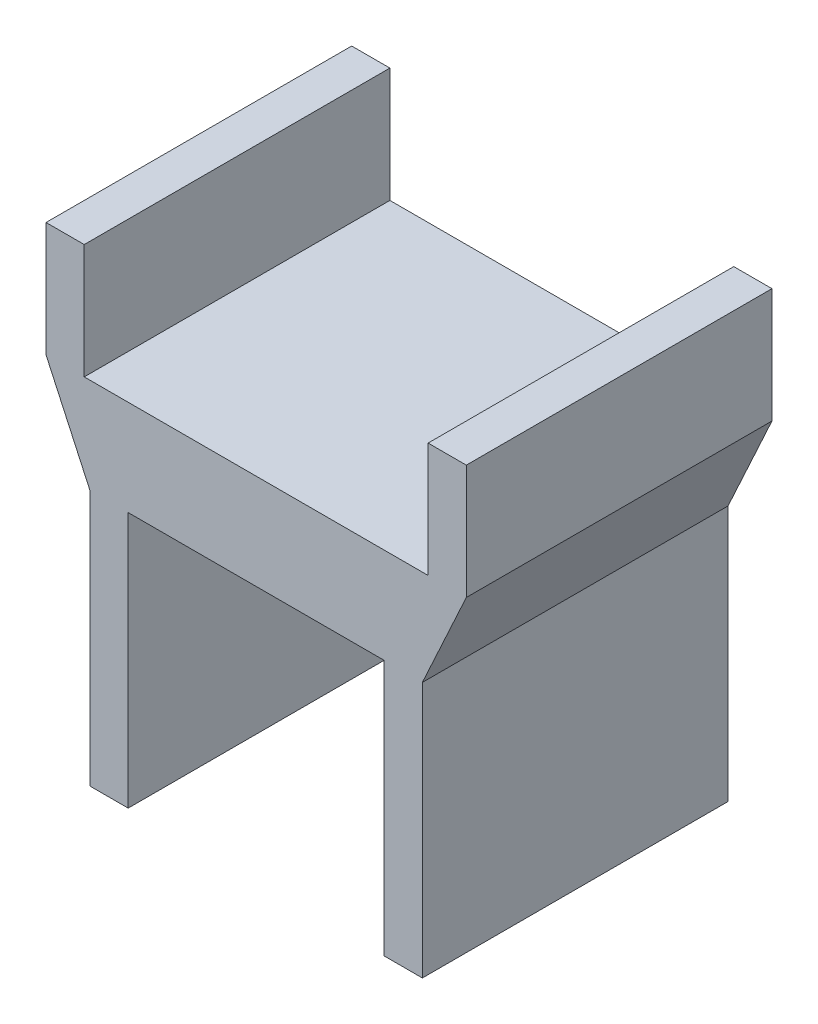
ISO-10303-21;
HEADER;
FILE_DESCRIPTION(('STEP AP214'),'2;1');
FILE_NAME('part.step','',(''),(''),'','','');
FILE_SCHEMA(('AUTOMOTIVE_DESIGN { 1 0 10303 214 1 1 1 1 }'));
ENDSEC;
DATA;
#1=APPLICATION_CONTEXT('core data for automotive mechanical design processes');
#2=APPLICATION_PROTOCOL_DEFINITION('international standard','automotive_design',2000,#1);
#3=PRODUCT_CONTEXT('',#1,'mechanical');
#4=PRODUCT('Part','Part','',(#3));
#5=PRODUCT_RELATED_PRODUCT_CATEGORY('part','',(#4));
#6=PRODUCT_DEFINITION_FORMATION('','',#4);
#7=PRODUCT_DEFINITION_CONTEXT('part definition',#1,'design');
#8=PRODUCT_DEFINITION('design','',#6,#7);
#9=PRODUCT_DEFINITION_SHAPE('','',#8);
#10=(LENGTH_UNIT() NAMED_UNIT(*) SI_UNIT(.MILLI.,.METRE.));
#11=(NAMED_UNIT(*) PLANE_ANGLE_UNIT() SI_UNIT($,.RADIAN.));
#12=(NAMED_UNIT(*) SI_UNIT($,.STERADIAN.) SOLID_ANGLE_UNIT());
#13=UNCERTAINTY_MEASURE_WITH_UNIT(LENGTH_MEASURE(1.E-05),#10,'distance_accuracy_value','');
#14=(GEOMETRIC_REPRESENTATION_CONTEXT(3) GLOBAL_UNCERTAINTY_ASSIGNED_CONTEXT((#13)) GLOBAL_UNIT_ASSIGNED_CONTEXT((#10,
#11,#12)) REPRESENTATION_CONTEXT('',''));
#15=CARTESIAN_POINT('',(0.,0.,0.));
#16=DIRECTION('',(0.,0.,1.));
#17=DIRECTION('',(1.,0.,0.));
#18=AXIS2_PLACEMENT_3D('',#15,#16,#17);
#19=CARTESIAN_POINT('',(0.,0.,16.));
#20=DIRECTION('',(1.,0.,0.));
#21=DIRECTION('',(0.,1.,0.));
#22=AXIS2_PLACEMENT_3D('',#19,#20,#21);
#23=PLANE('',#22);
#24=DIRECTION('',(0.,-1.,0.));
#25=VECTOR('',#24,1.);
#26=CARTESIAN_POINT('',(0.,0.,0.));
#27=LINE('',#26,#25);
#28=CARTESIAN_POINT('',(0.,0.,0.));
#29=VERTEX_POINT('',#28);
#30=CARTESIAN_POINT('',(0.,-13.4,0.));
#31=VERTEX_POINT('',#30);
#32=EDGE_CURVE('E174',#29,#31,#27,.T.);
#33=ORIENTED_EDGE('',*,*,#32,.F.);
#34=DIRECTION('',(0.,0.,-1.));
#35=VECTOR('',#34,1.);
#36=CARTESIAN_POINT('',(0.,0.,16.));
#37=LINE('',#36,#35);
#38=CARTESIAN_POINT('',(0.,0.,16.));
#39=VERTEX_POINT('',#38);
#40=EDGE_CURVE('E11',#39,#29,#37,.T.);
#41=ORIENTED_EDGE('',*,*,#40,.F.);
#42=DIRECTION('',(0.,-1.,0.));
#43=VECTOR('',#42,1.);
#44=CARTESIAN_POINT('',(0.,0.,16.));
#45=LINE('',#44,#43);
#46=CARTESIAN_POINT('',(0.,-13.4,16.));
#47=VERTEX_POINT('',#46);
#48=EDGE_CURVE('E214',#39,#47,#45,.T.);
#49=ORIENTED_EDGE('',*,*,#48,.T.);
#50=DIRECTION('',(0.,0.,-1.));
#51=VECTOR('',#50,1.);
#52=CARTESIAN_POINT('',(0.,-13.4,16.));
#53=LINE('',#52,#51);
#54=EDGE_CURVE('E49',#47,#31,#53,.T.);
#55=ORIENTED_EDGE('',*,*,#54,.T.);
#56=EDGE_LOOP('',(#33,#41,#49,#55));
#57=FACE_BOUND('',#56,.T.);
#58=ADVANCED_FACE('F33',(#57),#23,.T.);
#59=CARTESIAN_POINT('',(0.,0.,16.));
#60=DIRECTION('',(0.,1.,0.));
#61=DIRECTION('',(0.,0.,1.));
#62=AXIS2_PLACEMENT_3D('',#59,#60,#61);
#63=PLANE('',#62);
#64=DIRECTION('',(1.,0.,0.));
#65=VECTOR('',#64,1.);
#66=CARTESIAN_POINT('',(0.,0.,0.));
#67=LINE('',#66,#65);
#68=CARTESIAN_POINT('',(13.4,0.,0.));
#69=VERTEX_POINT('',#68);
#70=EDGE_CURVE('E176',#29,#69,#67,.T.);
#71=ORIENTED_EDGE('',*,*,#70,.T.);
#72=DIRECTION('',(0.,0.,-1.));
#73=VECTOR('',#72,1.);
#74=CARTESIAN_POINT('',(13.4,0.,16.));
#75=LINE('',#74,#73);
#76=CARTESIAN_POINT('',(13.4,0.,16.));
#77=VERTEX_POINT('',#76);
#78=EDGE_CURVE('E41',#77,#69,#75,.T.);
#79=ORIENTED_EDGE('',*,*,#78,.F.);
#80=DIRECTION('',(1.,0.,0.));
#81=VECTOR('',#80,1.);
#82=CARTESIAN_POINT('',(0.,0.,16.));
#83=LINE('',#82,#81);
#84=EDGE_CURVE('E565',#39,#77,#83,.T.);
#85=ORIENTED_EDGE('',*,*,#84,.F.);
#86=ORIENTED_EDGE('',*,*,#40,.T.);
#87=EDGE_LOOP('',(#71,#79,#85,#86));
#88=FACE_BOUND('',#87,.T.);
#89=ADVANCED_FACE('F302',(#88),#63,.F.);
#90=CARTESIAN_POINT('',(13.4,0.,16.));
#91=DIRECTION('',(1.,0.,0.));
#92=DIRECTION('',(0.,1.,0.));
#93=AXIS2_PLACEMENT_3D('',#90,#91,#92);
#94=PLANE('',#93);
#95=DIRECTION('',(0.,-1.,0.));
#96=VECTOR('',#95,1.);
#97=CARTESIAN_POINT('',(13.4,0.,0.));
#98=LINE('',#97,#96);
#99=CARTESIAN_POINT('',(13.4,-13.4,0.));
#100=VERTEX_POINT('',#99);
#101=EDGE_CURVE('E178',#69,#100,#98,.T.);
#102=ORIENTED_EDGE('',*,*,#101,.T.);
#103=DIRECTION('',(0.,0.,-1.));
#104=VECTOR('',#103,1.);
#105=CARTESIAN_POINT('',(13.4,-13.4,16.));
#106=LINE('',#105,#104);
#107=CARTESIAN_POINT('',(13.4,-13.4,16.));
#108=VERTEX_POINT('',#107);
#109=EDGE_CURVE('E238',#108,#100,#106,.T.);
#110=ORIENTED_EDGE('',*,*,#109,.F.);
#111=DIRECTION('',(0.,-1.,0.));
#112=VECTOR('',#111,1.);
#113=CARTESIAN_POINT('',(13.4,0.,16.));
#114=LINE('',#113,#112);
#115=EDGE_CURVE('E247',#77,#108,#114,.T.);
#116=ORIENTED_EDGE('',*,*,#115,.F.);
#117=ORIENTED_EDGE('',*,*,#78,.T.);
#118=EDGE_LOOP('',(#102,#110,#116,#117));
#119=FACE_BOUND('',#118,.T.);
#120=ADVANCED_FACE('F245',(#119),#94,.F.);
#121=CARTESIAN_POINT('',(0.,-13.4,16.));
#122=DIRECTION('',(0.,1.,0.));
#123=DIRECTION('',(0.,0.,1.));
#124=AXIS2_PLACEMENT_3D('',#121,#122,#123);
#125=PLANE('',#124);
#126=DIRECTION('',(1.,0.,0.));
#127=VECTOR('',#126,1.);
#128=CARTESIAN_POINT('',(0.,-13.4,0.));
#129=LINE('',#128,#127);
#130=CARTESIAN_POINT('',(15.4,-13.4,0.));
#131=VERTEX_POINT('',#130);
#132=EDGE_CURVE('E180',#100,#131,#129,.T.);
#133=ORIENTED_EDGE('',*,*,#132,.T.);
#134=DIRECTION('',(0.,0.,-1.));
#135=VECTOR('',#134,1.);
#136=CARTESIAN_POINT('',(15.4,-13.4,16.));
#137=LINE('',#136,#135);
#138=CARTESIAN_POINT('',(15.4,-13.4,16.));
#139=VERTEX_POINT('',#138);
#140=EDGE_CURVE('E235',#139,#131,#137,.T.);
#141=ORIENTED_EDGE('',*,*,#140,.F.);
#142=DIRECTION('',(1.,0.,0.));
#143=VECTOR('',#142,1.);
#144=CARTESIAN_POINT('',(0.,-13.4,16.));
#145=LINE('',#144,#143);
#146=EDGE_CURVE('E266',#108,#139,#145,.T.);
#147=ORIENTED_EDGE('',*,*,#146,.F.);
#148=ORIENTED_EDGE('',*,*,#109,.T.);
#149=EDGE_LOOP('',(#133,#141,#147,#148));
#150=FACE_BOUND('',#149,.T.);
#151=ADVANCED_FACE('F256',(#150),#125,.F.);
#152=CARTESIAN_POINT('',(15.4,0.,16.));
#153=DIRECTION('',(-1.,0.,0.));
#154=DIRECTION('',(0.,0.,1.));
#155=AXIS2_PLACEMENT_3D('',#152,#153,#154);
#156=PLANE('',#155);
#157=DIRECTION('',(0.,1.,0.));
#158=VECTOR('',#157,1.);
#159=CARTESIAN_POINT('',(15.4,0.,0.));
#160=LINE('',#159,#158);
#161=CARTESIAN_POINT('',(15.4,0.,0.));
#162=VERTEX_POINT('',#161);
#163=EDGE_CURVE('E182',#131,#162,#160,.T.);
#164=ORIENTED_EDGE('',*,*,#163,.T.);
#165=DIRECTION('',(0.,0.,-1.));
#166=VECTOR('',#165,1.);
#167=CARTESIAN_POINT('',(15.4,0.,16.));
#168=LINE('',#167,#166);
#169=CARTESIAN_POINT('',(15.4,0.,16.));
#170=VERTEX_POINT('',#169);
#171=EDGE_CURVE('E233',#170,#162,#168,.T.);
#172=ORIENTED_EDGE('',*,*,#171,.F.);
#173=DIRECTION('',(0.,1.,0.));
#174=VECTOR('',#173,1.);
#175=CARTESIAN_POINT('',(15.4,0.,16.));
#176=LINE('',#175,#174);
#177=EDGE_CURVE('E262',#139,#170,#176,.T.);
#178=ORIENTED_EDGE('',*,*,#177,.F.);
#179=ORIENTED_EDGE('',*,*,#140,.T.);
#180=EDGE_LOOP('',(#164,#172,#178,#179));
#181=FACE_BOUND('',#180,.T.);
#182=ADVANCED_FACE('F260',(#181),#156,.F.);
#183=CARTESIAN_POINT('',(12.7104655001651,-5.84681413007593,16.));
#184=DIRECTION('',(0.908490452678575,-0.417905608232144,0.));
#185=DIRECTION('',(0.417905608232144,0.908490452678575,0.));
#186=AXIS2_PLACEMENT_3D('',#183,#184,#185);
#187=PLANE('',#186);
#188=DIRECTION('',(-0.417905608232144,-0.908490452678575,0.));
#189=VECTOR('',#188,1.);
#190=CARTESIAN_POINT('',(12.7104655001651,-5.84681413007593,0.));
#191=LINE('',#190,#189);
#192=CARTESIAN_POINT('',(17.7,5.,0.));
#193=VERTEX_POINT('',#192);
#194=EDGE_CURVE('E185',#193,#162,#191,.T.);
#195=ORIENTED_EDGE('',*,*,#194,.F.);
#196=DIRECTION('',(0.,0.,-1.));
#197=VECTOR('',#196,1.);
#198=CARTESIAN_POINT('',(17.7,5.,16.));
#199=LINE('',#198,#197);
#200=CARTESIAN_POINT('',(17.7,5.,16.));
#201=VERTEX_POINT('',#200);
#202=EDGE_CURVE('E231',#201,#193,#199,.T.);
#203=ORIENTED_EDGE('',*,*,#202,.F.);
#204=DIRECTION('',(-0.417905608232144,-0.908490452678575,0.));
#205=VECTOR('',#204,1.);
#206=CARTESIAN_POINT('',(12.7104655001651,-5.84681413007593,16.));
#207=LINE('',#206,#205);
#208=EDGE_CURVE('E265',#201,#170,#207,.T.);
#209=ORIENTED_EDGE('',*,*,#208,.T.);
#210=ORIENTED_EDGE('',*,*,#171,.T.);
#211=EDGE_LOOP('',(#195,#203,#209,#210));
#212=FACE_BOUND('',#211,.T.);
#213=ADVANCED_FACE('F315',(#212),#187,.T.);
#214=CARTESIAN_POINT('',(17.7,0.,16.));
#215=DIRECTION('',(-1.,0.,0.));
#216=DIRECTION('',(0.,0.,1.));
#217=AXIS2_PLACEMENT_3D('',#214,#215,#216);
#218=PLANE('',#217);
#219=DIRECTION('',(0.,1.,0.));
#220=VECTOR('',#219,1.);
#221=CARTESIAN_POINT('',(17.7,0.,0.));
#222=LINE('',#221,#220);
#223=CARTESIAN_POINT('',(17.7,11.,0.));
#224=VERTEX_POINT('',#223);
#225=EDGE_CURVE('E188',#193,#224,#222,.T.);
#226=ORIENTED_EDGE('',*,*,#225,.T.);
#227=DIRECTION('',(0.,0.,-1.));
#228=VECTOR('',#227,1.);
#229=CARTESIAN_POINT('',(17.7,11.,16.));
#230=LINE('',#229,#228);
#231=CARTESIAN_POINT('',(17.7,11.,16.));
#232=VERTEX_POINT('',#231);
#233=EDGE_CURVE('E229',#232,#224,#230,.T.);
#234=ORIENTED_EDGE('',*,*,#233,.F.);
#235=DIRECTION('',(0.,1.,0.));
#236=VECTOR('',#235,1.);
#237=CARTESIAN_POINT('',(17.7,0.,16.));
#238=LINE('',#237,#236);
#239=EDGE_CURVE('E268',#201,#232,#238,.T.);
#240=ORIENTED_EDGE('',*,*,#239,.F.);
#241=ORIENTED_EDGE('',*,*,#202,.T.);
#242=EDGE_LOOP('',(#226,#234,#240,#241));
#243=FACE_BOUND('',#242,.T.);
#244=ADVANCED_FACE('F318',(#243),#218,.F.);
#245=CARTESIAN_POINT('',(0.,11.,16.));
#246=DIRECTION('',(0.,1.,0.));
#247=DIRECTION('',(0.,0.,1.));
#248=AXIS2_PLACEMENT_3D('',#245,#246,#247);
#249=PLANE('',#248);
#250=DIRECTION('',(1.,0.,0.));
#251=VECTOR('',#250,1.);
#252=CARTESIAN_POINT('',(0.,11.,0.));
#253=LINE('',#252,#251);
#254=CARTESIAN_POINT('',(15.7,11.,0.));
#255=VERTEX_POINT('',#254);
#256=EDGE_CURVE('E191',#255,#224,#253,.T.);
#257=ORIENTED_EDGE('',*,*,#256,.F.);
#258=DIRECTION('',(0.,0.,-1.));
#259=VECTOR('',#258,1.);
#260=CARTESIAN_POINT('',(15.7,11.,16.));
#261=LINE('',#260,#259);
#262=CARTESIAN_POINT('',(15.7,11.,16.));
#263=VERTEX_POINT('',#262);
#264=EDGE_CURVE('E227',#263,#255,#261,.T.);
#265=ORIENTED_EDGE('',*,*,#264,.F.);
#266=DIRECTION('',(1.,0.,0.));
#267=VECTOR('',#266,1.);
#268=CARTESIAN_POINT('',(0.,11.,16.));
#269=LINE('',#268,#267);
#270=EDGE_CURVE('E274',#263,#232,#269,.T.);
#271=ORIENTED_EDGE('',*,*,#270,.T.);
#272=ORIENTED_EDGE('',*,*,#233,.T.);
#273=EDGE_LOOP('',(#257,#265,#271,#272));
#274=FACE_BOUND('',#273,.T.);
#275=ADVANCED_FACE('F322',(#274),#249,.T.);
#276=CARTESIAN_POINT('',(15.7,0.,16.));
#277=DIRECTION('',(-1.,0.,0.));
#278=DIRECTION('',(0.,0.,1.));
#279=AXIS2_PLACEMENT_3D('',#276,#277,#278);
#280=PLANE('',#279);
#281=DIRECTION('',(0.,1.,0.));
#282=VECTOR('',#281,1.);
#283=CARTESIAN_POINT('',(15.7,0.,0.));
#284=LINE('',#283,#282);
#285=CARTESIAN_POINT('',(15.7,5.,0.));
#286=VERTEX_POINT('',#285);
#287=EDGE_CURVE('E194',#286,#255,#284,.T.);
#288=ORIENTED_EDGE('',*,*,#287,.F.);
#289=DIRECTION('',(0.,0.,-1.));
#290=VECTOR('',#289,1.);
#291=CARTESIAN_POINT('',(15.7,5.,16.));
#292=LINE('',#291,#290);
#293=CARTESIAN_POINT('',(15.7,5.,16.));
#294=VERTEX_POINT('',#293);
#295=EDGE_CURVE('E225',#294,#286,#292,.T.);
#296=ORIENTED_EDGE('',*,*,#295,.F.);
#297=DIRECTION('',(0.,1.,0.));
#298=VECTOR('',#297,1.);
#299=CARTESIAN_POINT('',(15.7,0.,16.));
#300=LINE('',#299,#298);
#301=EDGE_CURVE('E277',#294,#263,#300,.T.);
#302=ORIENTED_EDGE('',*,*,#301,.T.);
#303=ORIENTED_EDGE('',*,*,#264,.T.);
#304=EDGE_LOOP('',(#288,#296,#302,#303));
#305=FACE_BOUND('',#304,.T.);
#306=ADVANCED_FACE('F326',(#305),#280,.T.);
#307=CARTESIAN_POINT('',(0.,5.,16.));
#308=DIRECTION('',(0.,1.,0.));
#309=DIRECTION('',(0.,0.,1.));
#310=AXIS2_PLACEMENT_3D('',#307,#308,#309);
#311=PLANE('',#310);
#312=DIRECTION('',(1.,0.,0.));
#313=VECTOR('',#312,1.);
#314=CARTESIAN_POINT('',(0.,5.,0.));
#315=LINE('',#314,#313);
#316=CARTESIAN_POINT('',(-2.3,5.,0.));
#317=VERTEX_POINT('',#316);
#318=EDGE_CURVE('E197',#317,#286,#315,.T.);
#319=ORIENTED_EDGE('',*,*,#318,.F.);
#320=DIRECTION('',(0.,0.,-1.));
#321=VECTOR('',#320,1.);
#322=CARTESIAN_POINT('',(-2.3,5.,16.));
#323=LINE('',#322,#321);
#324=CARTESIAN_POINT('',(-2.3,5.,16.));
#325=VERTEX_POINT('',#324);
#326=EDGE_CURVE('E223',#325,#317,#323,.T.);
#327=ORIENTED_EDGE('',*,*,#326,.F.);
#328=DIRECTION('',(1.,0.,0.));
#329=VECTOR('',#328,1.);
#330=CARTESIAN_POINT('',(0.,5.,16.));
#331=LINE('',#330,#329);
#332=EDGE_CURVE('E280',#325,#294,#331,.T.);
#333=ORIENTED_EDGE('',*,*,#332,.T.);
#334=ORIENTED_EDGE('',*,*,#295,.T.);
#335=EDGE_LOOP('',(#319,#327,#333,#334));
#336=FACE_BOUND('',#335,.T.);
#337=ADVANCED_FACE('F330',(#336),#311,.T.);
#338=CARTESIAN_POINT('',(-2.3,0.,16.));
#339=DIRECTION('',(-1.,0.,0.));
#340=DIRECTION('',(0.,0.,1.));
#341=AXIS2_PLACEMENT_3D('',#338,#339,#340);
#342=PLANE('',#341);
#343=DIRECTION('',(0.,1.,0.));
#344=VECTOR('',#343,1.);
#345=CARTESIAN_POINT('',(-2.3,0.,0.));
#346=LINE('',#345,#344);
#347=CARTESIAN_POINT('',(-2.3,11.,0.));
#348=VERTEX_POINT('',#347);
#349=EDGE_CURVE('E200',#317,#348,#346,.T.);
#350=ORIENTED_EDGE('',*,*,#349,.T.);
#351=DIRECTION('',(0.,0.,-1.));
#352=VECTOR('',#351,1.);
#353=CARTESIAN_POINT('',(-2.3,11.,16.));
#354=LINE('',#353,#352);
#355=CARTESIAN_POINT('',(-2.3,11.,16.));
#356=VERTEX_POINT('',#355);
#357=EDGE_CURVE('E220',#356,#348,#354,.T.);
#358=ORIENTED_EDGE('',*,*,#357,.F.);
#359=DIRECTION('',(0.,1.,0.));
#360=VECTOR('',#359,1.);
#361=CARTESIAN_POINT('',(-2.3,0.,16.));
#362=LINE('',#361,#360);
#363=EDGE_CURVE('E283',#325,#356,#362,.T.);
#364=ORIENTED_EDGE('',*,*,#363,.F.);
#365=ORIENTED_EDGE('',*,*,#326,.T.);
#366=EDGE_LOOP('',(#350,#358,#364,#365));
#367=FACE_BOUND('',#366,.T.);
#368=ADVANCED_FACE('F334',(#367),#342,.F.);
#369=CARTESIAN_POINT('',(0.,11.,16.));
#370=DIRECTION('',(0.,-1.,0.));
#371=DIRECTION('',(0.,0.,-1.));
#372=AXIS2_PLACEMENT_3D('',#369,#370,#371);
#373=PLANE('',#372);
#374=DIRECTION('',(-1.,0.,0.));
#375=VECTOR('',#374,1.);
#376=CARTESIAN_POINT('',(0.,11.,0.));
#377=LINE('',#376,#375);
#378=CARTESIAN_POINT('',(-4.3,11.,0.));
#379=VERTEX_POINT('',#378);
#380=EDGE_CURVE('E202',#348,#379,#377,.T.);
#381=ORIENTED_EDGE('',*,*,#380,.T.);
#382=DIRECTION('',(0.,0.,-1.));
#383=VECTOR('',#382,1.);
#384=CARTESIAN_POINT('',(-4.3,11.,16.));
#385=LINE('',#384,#383);
#386=CARTESIAN_POINT('',(-4.3,11.,16.));
#387=VERTEX_POINT('',#386);
#388=EDGE_CURVE('E218',#387,#379,#385,.T.);
#389=ORIENTED_EDGE('',*,*,#388,.F.);
#390=DIRECTION('',(-1.,0.,0.));
#391=VECTOR('',#390,1.);
#392=CARTESIAN_POINT('',(0.,11.,16.));
#393=LINE('',#392,#391);
#394=EDGE_CURVE('E285',#356,#387,#393,.T.);
#395=ORIENTED_EDGE('',*,*,#394,.F.);
#396=ORIENTED_EDGE('',*,*,#357,.T.);
#397=EDGE_LOOP('',(#381,#389,#395,#396));
#398=FACE_BOUND('',#397,.T.);
#399=ADVANCED_FACE('F338',(#398),#373,.F.);
#400=CARTESIAN_POINT('',(-4.3,0.,16.));
#401=DIRECTION('',(-1.,0.,0.));
#402=DIRECTION('',(0.,0.,1.));
#403=AXIS2_PLACEMENT_3D('',#400,#401,#402);
#404=PLANE('',#403);
#405=DIRECTION('',(0.,1.,0.));
#406=VECTOR('',#405,1.);
#407=CARTESIAN_POINT('',(-4.3,0.,0.));
#408=LINE('',#407,#406);
#409=CARTESIAN_POINT('',(-4.3,5.,0.));
#410=VERTEX_POINT('',#409);
#411=EDGE_CURVE('E205',#410,#379,#408,.T.);
#412=ORIENTED_EDGE('',*,*,#411,.F.);
#413=DIRECTION('',(0.,0.,-1.));
#414=VECTOR('',#413,1.);
#415=CARTESIAN_POINT('',(-4.3,5.,16.));
#416=LINE('',#415,#414);
#417=CARTESIAN_POINT('',(-4.3,5.,16.));
#418=VERTEX_POINT('',#417);
#419=EDGE_CURVE('E166',#418,#410,#416,.T.);
#420=ORIENTED_EDGE('',*,*,#419,.F.);
#421=DIRECTION('',(0.,1.,0.));
#422=VECTOR('',#421,1.);
#423=CARTESIAN_POINT('',(-4.3,0.,16.));
#424=LINE('',#423,#422);
#425=EDGE_CURVE('E156',#418,#387,#424,.T.);
#426=ORIENTED_EDGE('',*,*,#425,.T.);
#427=ORIENTED_EDGE('',*,*,#388,.T.);
#428=EDGE_LOOP('',(#412,#420,#426,#427));
#429=FACE_BOUND('',#428,.T.);
#430=ADVANCED_FACE('F288',(#429),#404,.T.);
#431=CARTESIAN_POINT('',(-1.65070980521624,-0.759326510399472,16.));
#432=DIRECTION('',(0.908490452678575,0.417905608232144,0.));
#433=DIRECTION('',(-0.417905608232144,0.908490452678575,0.));
#434=AXIS2_PLACEMENT_3D('',#431,#432,#433);
#435=PLANE('',#434);
#436=DIRECTION('',(0.417905608232144,-0.908490452678575,0.));
#437=VECTOR('',#436,1.);
#438=CARTESIAN_POINT('',(-1.65070980521624,-0.759326510399472,0.));
#439=LINE('',#438,#437);
#440=CARTESIAN_POINT('',(-2.,0.,0.));
#441=VERTEX_POINT('',#440);
#442=EDGE_CURVE('E163',#410,#441,#439,.T.);
#443=ORIENTED_EDGE('',*,*,#442,.T.);
#444=DIRECTION('',(0.,0.,-1.));
#445=VECTOR('',#444,1.);
#446=CARTESIAN_POINT('',(-2.,0.,16.));
#447=LINE('',#446,#445);
#448=CARTESIAN_POINT('',(-2.,0.,16.));
#449=VERTEX_POINT('',#448);
#450=EDGE_CURVE('E160',#449,#441,#447,.T.);
#451=ORIENTED_EDGE('',*,*,#450,.F.);
#452=DIRECTION('',(0.417905608232144,-0.908490452678575,0.));
#453=VECTOR('',#452,1.);
#454=CARTESIAN_POINT('',(-1.65070980521624,-0.759326510399472,16.));
#455=LINE('',#454,#453);
#456=EDGE_CURVE('E148',#418,#449,#455,.T.);
#457=ORIENTED_EDGE('',*,*,#456,.F.);
#458=ORIENTED_EDGE('',*,*,#419,.T.);
#459=EDGE_LOOP('',(#443,#451,#457,#458));
#460=FACE_BOUND('',#459,.T.);
#461=ADVANCED_FACE('F161',(#460),#435,.F.);
#462=CARTESIAN_POINT('',(-2.,0.,16.));
#463=DIRECTION('',(1.,0.,0.));
#464=DIRECTION('',(0.,1.,0.));
#465=AXIS2_PLACEMENT_3D('',#462,#463,#464);
#466=PLANE('',#465);
#467=DIRECTION('',(0.,-1.,0.));
#468=VECTOR('',#467,1.);
#469=CARTESIAN_POINT('',(-2.,0.,0.));
#470=LINE('',#469,#468);
#471=CARTESIAN_POINT('',(-2.,-13.4,0.));
#472=VERTEX_POINT('',#471);
#473=EDGE_CURVE('E209',#441,#472,#470,.T.);
#474=ORIENTED_EDGE('',*,*,#473,.T.);
#475=DIRECTION('',(0.,0.,-1.));
#476=VECTOR('',#475,1.);
#477=CARTESIAN_POINT('',(-2.,-13.4,16.));
#478=LINE('',#477,#476);
#479=CARTESIAN_POINT('',(-2.,-13.4,16.));
#480=VERTEX_POINT('',#479);
#481=EDGE_CURVE('E99',#480,#472,#478,.T.);
#482=ORIENTED_EDGE('',*,*,#481,.F.);
#483=DIRECTION('',(0.,-1.,0.));
#484=VECTOR('',#483,1.);
#485=CARTESIAN_POINT('',(-2.,0.,16.));
#486=LINE('',#485,#484);
#487=EDGE_CURVE('E154',#449,#480,#486,.T.);
#488=ORIENTED_EDGE('',*,*,#487,.F.);
#489=ORIENTED_EDGE('',*,*,#450,.T.);
#490=EDGE_LOOP('',(#474,#482,#488,#489));
#491=FACE_BOUND('',#490,.T.);
#492=ADVANCED_FACE('F168',(#491),#466,.F.);
#493=CARTESIAN_POINT('',(0.,-13.4,16.));
#494=DIRECTION('',(0.,-1.,0.));
#495=DIRECTION('',(0.,0.,-1.));
#496=AXIS2_PLACEMENT_3D('',#493,#494,#495);
#497=PLANE('',#496);
#498=DIRECTION('',(-1.,0.,0.));
#499=VECTOR('',#498,1.);
#500=CARTESIAN_POINT('',(0.,-13.4,0.));
#501=LINE('',#500,#499);
#502=EDGE_CURVE('E211',#31,#472,#501,.T.);
#503=ORIENTED_EDGE('',*,*,#502,.F.);
#504=ORIENTED_EDGE('',*,*,#54,.F.);
#505=DIRECTION('',(-1.,0.,0.));
#506=VECTOR('',#505,1.);
#507=CARTESIAN_POINT('',(0.,-13.4,16.));
#508=LINE('',#507,#506);
#509=EDGE_CURVE('E169',#47,#480,#508,.T.);
#510=ORIENTED_EDGE('',*,*,#509,.T.);
#511=ORIENTED_EDGE('',*,*,#481,.T.);
#512=EDGE_LOOP('',(#503,#504,#510,#511));
#513=FACE_BOUND('',#512,.T.);
#514=ADVANCED_FACE('F291',(#513),#497,.T.);
#515=CARTESIAN_POINT('',(0.,0.,16.));
#516=DIRECTION('',(0.,0.,1.));
#517=DIRECTION('',(1.,0.,0.));
#518=AXIS2_PLACEMENT_3D('',#515,#516,#517);
#519=PLANE('',#518);
#520=ORIENTED_EDGE('',*,*,#48,.F.);
#521=ORIENTED_EDGE('',*,*,#84,.T.);
#522=ORIENTED_EDGE('',*,*,#115,.T.);
#523=ORIENTED_EDGE('',*,*,#146,.T.);
#524=ORIENTED_EDGE('',*,*,#177,.T.);
#525=ORIENTED_EDGE('',*,*,#208,.F.);
#526=ORIENTED_EDGE('',*,*,#239,.T.);
#527=ORIENTED_EDGE('',*,*,#270,.F.);
#528=ORIENTED_EDGE('',*,*,#301,.F.);
#529=ORIENTED_EDGE('',*,*,#332,.F.);
#530=ORIENTED_EDGE('',*,*,#363,.T.);
#531=ORIENTED_EDGE('',*,*,#394,.T.);
#532=ORIENTED_EDGE('',*,*,#425,.F.);
#533=ORIENTED_EDGE('',*,*,#456,.T.);
#534=ORIENTED_EDGE('',*,*,#487,.T.);
#535=ORIENTED_EDGE('',*,*,#509,.F.);
#536=EDGE_LOOP('',(#520,#521,#522,#523,#524,#525,#526,#527,#528,#529,#530,#531,#532,#533,#534,#535));
#537=FACE_BOUND('',#536,.T.);
#538=ADVANCED_FACE('F151',(#537),#519,.T.);
#539=CARTESIAN_POINT('',(0.,0.,0.));
#540=DIRECTION('',(0.,0.,1.));
#541=DIRECTION('',(1.,0.,0.));
#542=AXIS2_PLACEMENT_3D('',#539,#540,#541);
#543=PLANE('',#542);
#544=ORIENTED_EDGE('',*,*,#32,.T.);
#545=ORIENTED_EDGE('',*,*,#502,.T.);
#546=ORIENTED_EDGE('',*,*,#473,.F.);
#547=ORIENTED_EDGE('',*,*,#442,.F.);
#548=ORIENTED_EDGE('',*,*,#411,.T.);
#549=ORIENTED_EDGE('',*,*,#380,.F.);
#550=ORIENTED_EDGE('',*,*,#349,.F.);
#551=ORIENTED_EDGE('',*,*,#318,.T.);
#552=ORIENTED_EDGE('',*,*,#287,.T.);
#553=ORIENTED_EDGE('',*,*,#256,.T.);
#554=ORIENTED_EDGE('',*,*,#225,.F.);
#555=ORIENTED_EDGE('',*,*,#194,.T.);
#556=ORIENTED_EDGE('',*,*,#163,.F.);
#557=ORIENTED_EDGE('',*,*,#132,.F.);
#558=ORIENTED_EDGE('',*,*,#101,.F.);
#559=ORIENTED_EDGE('',*,*,#70,.F.);
#560=EDGE_LOOP('',(#544,#545,#546,#547,#548,#549,#550,#551,#552,#553,#554,#555,#556,#557,#558,#559));
#561=FACE_BOUND('',#560,.T.);
#562=ADVANCED_FACE('F252',(#561),#543,.F.);
#563=CLOSED_SHELL('',(#58,#89,#120,#151,#182,#213,#244,#275,#306,#337,#368,#399,#430,#461,#492,
#514,#538,#562));
#564=MANIFOLD_SOLID_BREP('B2',#563);
#565=ADVANCED_BREP_SHAPE_REPRESENTATION('',(#18,#564),#14);
#566=SHAPE_DEFINITION_REPRESENTATION(#9,#565);
ENDSEC;
END-ISO-10303-21;
